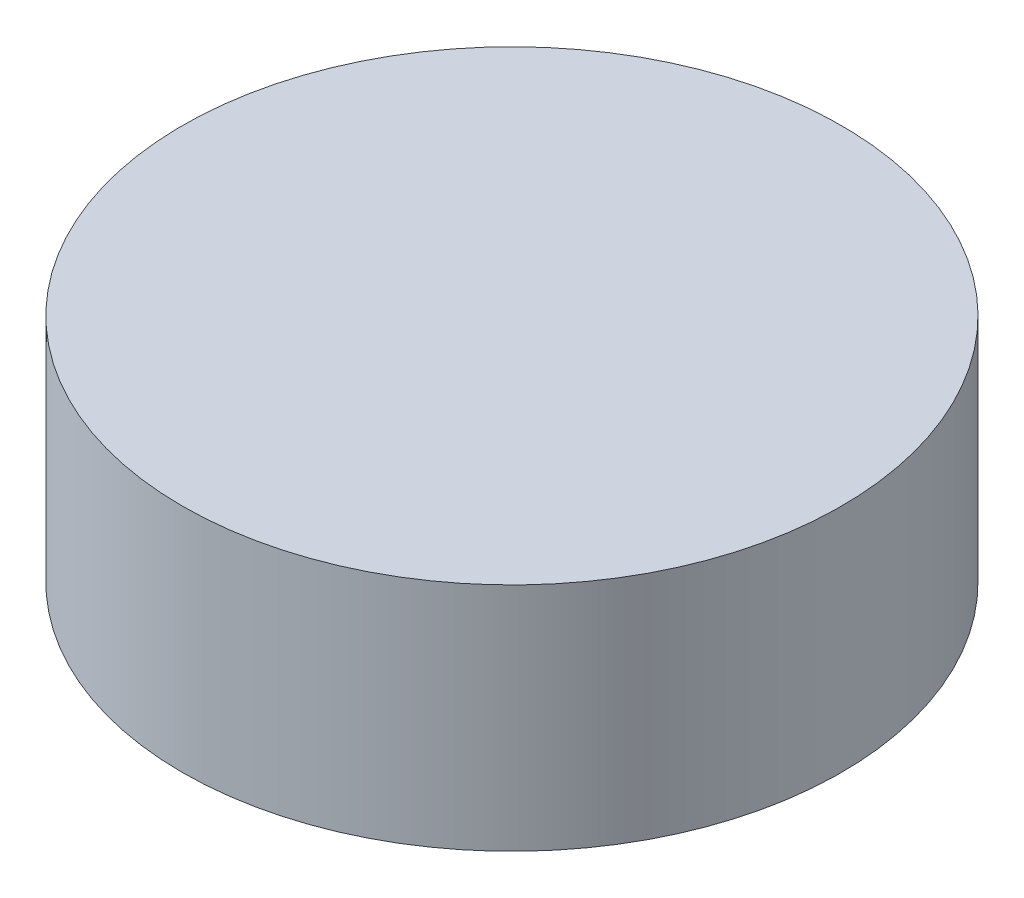
ISO-10303-21;
HEADER;
FILE_DESCRIPTION(('STEP AP214'),'2;1');
FILE_NAME('part.step','',(''),(''),'','','');
FILE_SCHEMA(('AUTOMOTIVE_DESIGN { 1 0 10303 214 1 1 1 1 }'));
ENDSEC;
DATA;
#1=APPLICATION_CONTEXT('core data for automotive mechanical design processes');
#2=APPLICATION_PROTOCOL_DEFINITION('international standard','automotive_design',2000,#1);
#3=PRODUCT_CONTEXT('',#1,'mechanical');
#4=PRODUCT('Part','Part','',(#3));
#5=PRODUCT_RELATED_PRODUCT_CATEGORY('part','',(#4));
#6=PRODUCT_DEFINITION_FORMATION('','',#4);
#7=PRODUCT_DEFINITION_CONTEXT('part definition',#1,'design');
#8=PRODUCT_DEFINITION('design','',#6,#7);
#9=PRODUCT_DEFINITION_SHAPE('','',#8);
#10=(LENGTH_UNIT() NAMED_UNIT(*) SI_UNIT(.MILLI.,.METRE.));
#11=(NAMED_UNIT(*) PLANE_ANGLE_UNIT() SI_UNIT($,.RADIAN.));
#12=(NAMED_UNIT(*) SI_UNIT($,.STERADIAN.) SOLID_ANGLE_UNIT());
#13=UNCERTAINTY_MEASURE_WITH_UNIT(LENGTH_MEASURE(1.E-05),#10,'distance_accuracy_value','');
#14=(GEOMETRIC_REPRESENTATION_CONTEXT(3) GLOBAL_UNCERTAINTY_ASSIGNED_CONTEXT((#13)) GLOBAL_UNIT_ASSIGNED_CONTEXT((#10,
#11,#12)) REPRESENTATION_CONTEXT('',''));
#15=CARTESIAN_POINT('',(0.,0.,0.));
#16=DIRECTION('',(0.,0.,1.));
#17=DIRECTION('',(1.,0.,0.));
#18=AXIS2_PLACEMENT_3D('',#15,#16,#17);
#19=CARTESIAN_POINT('',(0.,2.778125,0.));
#20=DIRECTION('',(0.,-1.,0.));
#21=DIRECTION('',(0.,0.,-1.));
#22=AXIS2_PLACEMENT_3D('',#19,#20,#21);
#23=CYLINDRICAL_SURFACE('',#22,3.96875);
#24=CARTESIAN_POINT('',(0.,2.778125,0.));
#25=DIRECTION('',(0.,1.,0.));
#26=DIRECTION('',(0.,0.,1.));
#27=AXIS2_PLACEMENT_3D('',#24,#25,#26);
#28=CIRCLE('',#27,3.96875);
#29=CARTESIAN_POINT('',(0.,2.778125,3.96875));
#30=VERTEX_POINT('',#29);
#31=EDGE_CURVE('E10',#30,#30,#28,.T.);
#32=ORIENTED_EDGE('',*,*,#31,.F.);
#33=EDGE_LOOP('',(#32));
#34=FACE_BOUND('',#33,.T.);
#35=CARTESIAN_POINT('',(0.,0.,0.));
#36=DIRECTION('',(0.,1.,0.));
#37=DIRECTION('',(0.,0.,1.));
#38=AXIS2_PLACEMENT_3D('',#35,#36,#37);
#39=CIRCLE('',#38,3.96875);
#40=CARTESIAN_POINT('',(0.,0.,3.96875));
#41=VERTEX_POINT('',#40);
#42=EDGE_CURVE('E38',#41,#41,#39,.T.);
#43=ORIENTED_EDGE('',*,*,#42,.T.);
#44=EDGE_LOOP('',(#43));
#45=FACE_BOUND('',#44,.T.);
#46=ADVANCED_FACE('F35',(#34,#45),#23,.T.);
#47=CARTESIAN_POINT('',(0.,2.778125,0.));
#48=DIRECTION('',(0.,1.,0.));
#49=DIRECTION('',(0.,0.,1.));
#50=AXIS2_PLACEMENT_3D('',#47,#48,#49);
#51=PLANE('',#50);
#52=ORIENTED_EDGE('',*,*,#31,.T.);
#53=EDGE_LOOP('',(#52));
#54=FACE_BOUND('',#53,.T.);
#55=ADVANCED_FACE('F50',(#54),#51,.T.);
#56=CARTESIAN_POINT('',(0.,0.,0.));
#57=DIRECTION('',(0.,1.,0.));
#58=DIRECTION('',(0.,0.,1.));
#59=AXIS2_PLACEMENT_3D('',#56,#57,#58);
#60=PLANE('',#59);
#61=ORIENTED_EDGE('',*,*,#42,.F.);
#62=EDGE_LOOP('',(#61));
#63=FACE_BOUND('',#62,.T.);
#64=ADVANCED_FACE('F48',(#63),#60,.F.);
#65=CLOSED_SHELL('',(#46,#55,#64));
#66=MANIFOLD_SOLID_BREP('B2',#65);
#67=ADVANCED_BREP_SHAPE_REPRESENTATION('',(#18,#66),#14);
#68=SHAPE_DEFINITION_REPRESENTATION(#9,#67);
ENDSEC;
END-ISO-10303-21;
